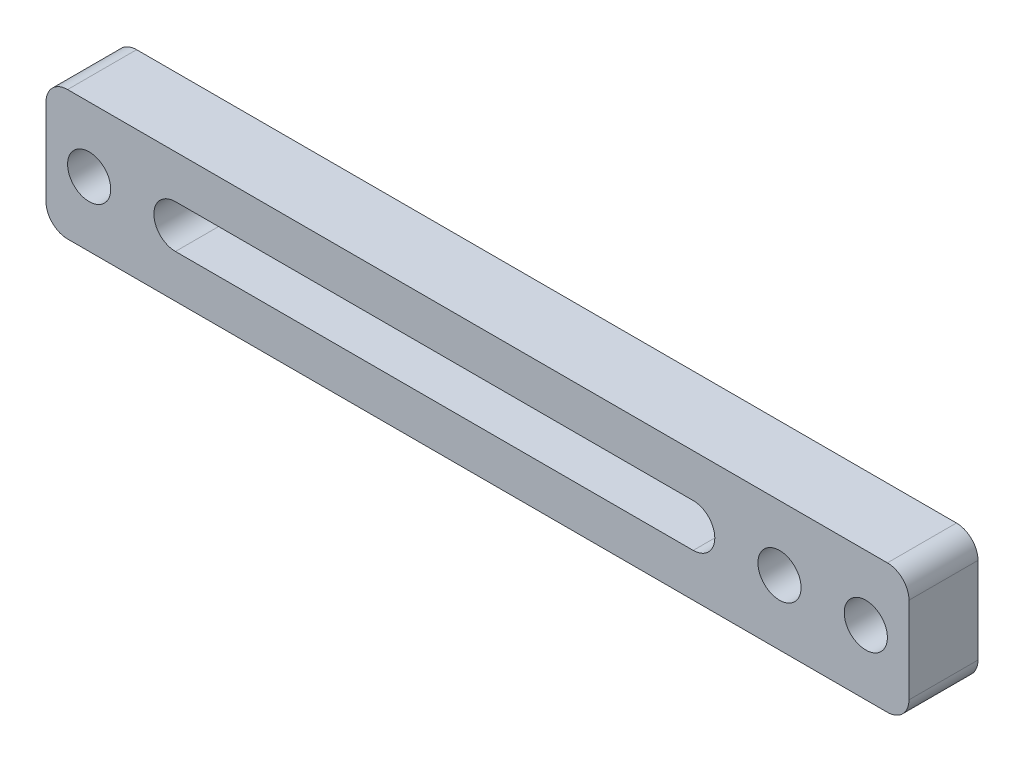
ISO-10303-21;
HEADER;
FILE_DESCRIPTION(('STEP AP214'),'2;1');
FILE_NAME('part.step','',(''),(''),'','','');
FILE_SCHEMA(('AUTOMOTIVE_DESIGN { 1 0 10303 214 1 1 1 1 }'));
ENDSEC;
DATA;
#1=APPLICATION_CONTEXT('core data for automotive mechanical design processes');
#2=APPLICATION_PROTOCOL_DEFINITION('international standard','automotive_design',2000,#1);
#3=PRODUCT_CONTEXT('',#1,'mechanical');
#4=PRODUCT('Part','Part','',(#3));
#5=PRODUCT_RELATED_PRODUCT_CATEGORY('part','',(#4));
#6=PRODUCT_DEFINITION_FORMATION('','',#4);
#7=PRODUCT_DEFINITION_CONTEXT('part definition',#1,'design');
#8=PRODUCT_DEFINITION('design','',#6,#7);
#9=PRODUCT_DEFINITION_SHAPE('','',#8);
#10=(LENGTH_UNIT() NAMED_UNIT(*) SI_UNIT(.MILLI.,.METRE.));
#11=(NAMED_UNIT(*) PLANE_ANGLE_UNIT() SI_UNIT($,.RADIAN.));
#12=(NAMED_UNIT(*) SI_UNIT($,.STERADIAN.) SOLID_ANGLE_UNIT());
#13=UNCERTAINTY_MEASURE_WITH_UNIT(LENGTH_MEASURE(1.E-05),#10,'distance_accuracy_value','');
#14=(GEOMETRIC_REPRESENTATION_CONTEXT(3) GLOBAL_UNCERTAINTY_ASSIGNED_CONTEXT((#13)) GLOBAL_UNIT_ASSIGNED_CONTEXT((#10,
#11,#12)) REPRESENTATION_CONTEXT('',''));
#15=CARTESIAN_POINT('',(0.,0.,0.));
#16=DIRECTION('',(0.,0.,1.));
#17=DIRECTION('',(1.,0.,0.));
#18=AXIS2_PLACEMENT_3D('',#15,#16,#17);
#19=CARTESIAN_POINT('',(0.,0.,8.));
#20=DIRECTION('',(1.,0.,0.));
#21=DIRECTION('',(0.,0.,-1.));
#22=AXIS2_PLACEMENT_3D('',#19,#20,#21);
#23=PLANE('',#22);
#24=DIRECTION('',(0.,-1.,0.));
#25=VECTOR('',#24,1.);
#26=CARTESIAN_POINT('',(0.,0.,0.));
#27=LINE('',#26,#25);
#28=CARTESIAN_POINT('',(0.,12.5,0.));
#29=VERTEX_POINT('',#28);
#30=CARTESIAN_POINT('',(0.,2.5,0.));
#31=VERTEX_POINT('',#30);
#32=EDGE_CURVE('E165',#29,#31,#27,.T.);
#33=ORIENTED_EDGE('',*,*,#32,.T.);
#34=DIRECTION('',(0.,0.,-1.));
#35=VECTOR('',#34,1.);
#36=CARTESIAN_POINT('',(0.,2.5,8.));
#37=LINE('',#36,#35);
#38=CARTESIAN_POINT('',(0.,2.5,8.));
#39=VERTEX_POINT('',#38);
#40=EDGE_CURVE('E11',#31,#39,#37,.F.);
#41=ORIENTED_EDGE('',*,*,#40,.T.);
#42=DIRECTION('',(0.,-1.,0.));
#43=VECTOR('',#42,1.);
#44=CARTESIAN_POINT('',(0.,0.,8.));
#45=LINE('',#44,#43);
#46=CARTESIAN_POINT('',(0.,12.5,8.));
#47=VERTEX_POINT('',#46);
#48=EDGE_CURVE('E169',#47,#39,#45,.T.);
#49=ORIENTED_EDGE('',*,*,#48,.F.);
#50=DIRECTION('',(0.,0.,-1.));
#51=VECTOR('',#50,1.);
#52=CARTESIAN_POINT('',(0.,12.5,8.));
#53=LINE('',#52,#51);
#54=EDGE_CURVE('E39',#47,#29,#53,.T.);
#55=ORIENTED_EDGE('',*,*,#54,.T.);
#56=EDGE_LOOP('',(#33,#41,#49,#55));
#57=FACE_BOUND('',#56,.T.);
#58=ADVANCED_FACE('F31',(#57),#23,.F.);
#59=CARTESIAN_POINT('',(0.,0.,8.));
#60=DIRECTION('',(0.,1.,0.));
#61=DIRECTION('',(0.,0.,1.));
#62=AXIS2_PLACEMENT_3D('',#59,#60,#61);
#63=PLANE('',#62);
#64=DIRECTION('',(1.,0.,0.));
#65=VECTOR('',#64,1.);
#66=CARTESIAN_POINT('',(0.,0.,0.));
#67=LINE('',#66,#65);
#68=CARTESIAN_POINT('',(2.5,0.,0.));
#69=VERTEX_POINT('',#68);
#70=CARTESIAN_POINT('',(97.5,0.,0.));
#71=VERTEX_POINT('',#70);
#72=EDGE_CURVE('E183',#69,#71,#67,.T.);
#73=ORIENTED_EDGE('',*,*,#72,.T.);
#74=DIRECTION('',(0.,0.,-1.));
#75=VECTOR('',#74,1.);
#76=CARTESIAN_POINT('',(97.5,0.,8.));
#77=LINE('',#76,#75);
#78=CARTESIAN_POINT('',(97.5,0.,8.));
#79=VERTEX_POINT('',#78);
#80=EDGE_CURVE('E205',#71,#79,#77,.F.);
#81=ORIENTED_EDGE('',*,*,#80,.T.);
#82=DIRECTION('',(1.,0.,0.));
#83=VECTOR('',#82,1.);
#84=CARTESIAN_POINT('',(0.,0.,8.));
#85=LINE('',#84,#83);
#86=CARTESIAN_POINT('',(2.5,0.,8.));
#87=VERTEX_POINT('',#86);
#88=EDGE_CURVE('E172',#87,#79,#85,.T.);
#89=ORIENTED_EDGE('',*,*,#88,.F.);
#90=DIRECTION('',(0.,0.,-1.));
#91=VECTOR('',#90,1.);
#92=CARTESIAN_POINT('',(2.5,0.,8.));
#93=LINE('',#92,#91);
#94=EDGE_CURVE('E202',#87,#69,#93,.T.);
#95=ORIENTED_EDGE('',*,*,#94,.T.);
#96=EDGE_LOOP('',(#73,#81,#89,#95));
#97=FACE_BOUND('',#96,.T.);
#98=ADVANCED_FACE('F234',(#97),#63,.F.);
#99=CARTESIAN_POINT('',(100.,0.,8.));
#100=DIRECTION('',(-1.,0.,0.));
#101=DIRECTION('',(0.,0.,1.));
#102=AXIS2_PLACEMENT_3D('',#99,#100,#101);
#103=PLANE('',#102);
#104=DIRECTION('',(0.,1.,0.));
#105=VECTOR('',#104,1.);
#106=CARTESIAN_POINT('',(100.,0.,8.));
#107=LINE('',#106,#105);
#108=CARTESIAN_POINT('',(100.,2.5,8.));
#109=VERTEX_POINT('',#108);
#110=CARTESIAN_POINT('',(100.,12.5,8.));
#111=VERTEX_POINT('',#110);
#112=EDGE_CURVE('E176',#109,#111,#107,.T.);
#113=ORIENTED_EDGE('',*,*,#112,.F.);
#114=DIRECTION('',(0.,0.,-1.));
#115=VECTOR('',#114,1.);
#116=CARTESIAN_POINT('',(100.,2.5,8.));
#117=LINE('',#116,#115);
#118=CARTESIAN_POINT('',(100.,2.5,0.));
#119=VERTEX_POINT('',#118);
#120=EDGE_CURVE('E191',#109,#119,#117,.T.);
#121=ORIENTED_EDGE('',*,*,#120,.T.);
#122=DIRECTION('',(0.,1.,0.));
#123=VECTOR('',#122,1.);
#124=CARTESIAN_POINT('',(100.,0.,0.));
#125=LINE('',#124,#123);
#126=CARTESIAN_POINT('',(100.,12.5,0.));
#127=VERTEX_POINT('',#126);
#128=EDGE_CURVE('E186',#119,#127,#125,.T.);
#129=ORIENTED_EDGE('',*,*,#128,.T.);
#130=DIRECTION('',(0.,0.,-1.));
#131=VECTOR('',#130,1.);
#132=CARTESIAN_POINT('',(100.,12.5,8.));
#133=LINE('',#132,#131);
#134=EDGE_CURVE('E180',#127,#111,#133,.F.);
#135=ORIENTED_EDGE('',*,*,#134,.T.);
#136=EDGE_LOOP('',(#113,#121,#129,#135));
#137=FACE_BOUND('',#136,.T.);
#138=ADVANCED_FACE('F243',(#137),#103,.F.);
#139=CARTESIAN_POINT('',(0.,15.,8.));
#140=DIRECTION('',(0.,-1.,0.));
#141=DIRECTION('',(0.,0.,-1.));
#142=AXIS2_PLACEMENT_3D('',#139,#140,#141);
#143=PLANE('',#142);
#144=DIRECTION('',(-1.,0.,0.));
#145=VECTOR('',#144,1.);
#146=CARTESIAN_POINT('',(0.,15.,8.));
#147=LINE('',#146,#145);
#148=CARTESIAN_POINT('',(97.5,15.,8.));
#149=VERTEX_POINT('',#148);
#150=CARTESIAN_POINT('',(2.5,15.,8.));
#151=VERTEX_POINT('',#150);
#152=EDGE_CURVE('E178',#149,#151,#147,.T.);
#153=ORIENTED_EDGE('',*,*,#152,.F.);
#154=DIRECTION('',(0.,0.,-1.));
#155=VECTOR('',#154,1.);
#156=CARTESIAN_POINT('',(97.5,15.,8.));
#157=LINE('',#156,#155);
#158=CARTESIAN_POINT('',(97.5,15.,0.));
#159=VERTEX_POINT('',#158);
#160=EDGE_CURVE('E215',#149,#159,#157,.T.);
#161=ORIENTED_EDGE('',*,*,#160,.T.);
#162=DIRECTION('',(-1.,0.,0.));
#163=VECTOR('',#162,1.);
#164=CARTESIAN_POINT('',(0.,15.,0.));
#165=LINE('',#164,#163);
#166=CARTESIAN_POINT('',(2.5,15.,0.));
#167=VERTEX_POINT('',#166);
#168=EDGE_CURVE('E173',#159,#167,#165,.T.);
#169=ORIENTED_EDGE('',*,*,#168,.T.);
#170=DIRECTION('',(0.,0.,-1.));
#171=VECTOR('',#170,1.);
#172=CARTESIAN_POINT('',(2.5,15.,8.));
#173=LINE('',#172,#171);
#174=EDGE_CURVE('E46',#167,#151,#173,.F.);
#175=ORIENTED_EDGE('',*,*,#174,.T.);
#176=EDGE_LOOP('',(#153,#161,#169,#175));
#177=FACE_BOUND('',#176,.T.);
#178=ADVANCED_FACE('F248',(#177),#143,.F.);
#179=CARTESIAN_POINT('',(0.,15.,8.));
#180=DIRECTION('',(0.,0.,-1.));
#181=DIRECTION('',(-1.,0.,0.));
#182=AXIS2_PLACEMENT_3D('',#179,#180,#181);
#183=PLANE('',#182);
#184=CARTESIAN_POINT('',(85.,7.5,8.));
#185=DIRECTION('',(0.,0.,1.));
#186=DIRECTION('',(1.,0.,0.));
#187=AXIS2_PLACEMENT_3D('',#184,#185,#186);
#188=CIRCLE('',#187,2.50000000000001);
#189=CARTESIAN_POINT('',(87.5,7.5,8.));
#190=VERTEX_POINT('',#189);
#191=EDGE_CURVE('E398',#190,#190,#188,.T.);
#192=ORIENTED_EDGE('',*,*,#191,.F.);
#193=EDGE_LOOP('',(#192));
#194=FACE_BOUND('',#193,.T.);
#195=CARTESIAN_POINT('',(95.,7.5,8.));
#196=DIRECTION('',(0.,0.,1.));
#197=DIRECTION('',(1.,0.,0.));
#198=AXIS2_PLACEMENT_3D('',#195,#196,#197);
#199=CIRCLE('',#198,2.5);
#200=CARTESIAN_POINT('',(97.5,7.5,8.));
#201=VERTEX_POINT('',#200);
#202=EDGE_CURVE('E402',#201,#201,#199,.T.);
#203=ORIENTED_EDGE('',*,*,#202,.F.);
#204=EDGE_LOOP('',(#203));
#205=FACE_BOUND('',#204,.T.);
#206=CARTESIAN_POINT('',(5.,7.5,8.));
#207=DIRECTION('',(0.,0.,1.));
#208=DIRECTION('',(1.,0.,0.));
#209=AXIS2_PLACEMENT_3D('',#206,#207,#208);
#210=CIRCLE('',#209,2.5);
#211=CARTESIAN_POINT('',(7.5,7.5,8.));
#212=VERTEX_POINT('',#211);
#213=EDGE_CURVE('E152',#212,#212,#210,.T.);
#214=ORIENTED_EDGE('',*,*,#213,.F.);
#215=EDGE_LOOP('',(#214));
#216=FACE_BOUND('',#215,.T.);
#217=DIRECTION('',(1.,0.,0.));
#218=VECTOR('',#217,1.);
#219=CARTESIAN_POINT('',(15.,5.,8.));
#220=LINE('',#219,#218);
#221=CARTESIAN_POINT('',(15.,5.,8.));
#222=VERTEX_POINT('',#221);
#223=CARTESIAN_POINT('',(75.,5.,8.));
#224=VERTEX_POINT('',#223);
#225=EDGE_CURVE('E158',#222,#224,#220,.T.);
#226=ORIENTED_EDGE('',*,*,#225,.F.);
#227=CARTESIAN_POINT('',(15.,7.5,8.));
#228=DIRECTION('',(0.,0.,1.));
#229=DIRECTION('',(1.,0.,0.));
#230=AXIS2_PLACEMENT_3D('',#227,#228,#229);
#231=CIRCLE('',#230,2.5);
#232=CARTESIAN_POINT('',(15.,10.,8.));
#233=VERTEX_POINT('',#232);
#234=EDGE_CURVE('E128',#233,#222,#231,.T.);
#235=ORIENTED_EDGE('',*,*,#234,.F.);
#236=DIRECTION('',(-1.,0.,0.));
#237=VECTOR('',#236,1.);
#238=CARTESIAN_POINT('',(15.,10.,8.));
#239=LINE('',#238,#237);
#240=CARTESIAN_POINT('',(75.,10.,8.));
#241=VERTEX_POINT('',#240);
#242=EDGE_CURVE('E146',#241,#233,#239,.T.);
#243=ORIENTED_EDGE('',*,*,#242,.F.);
#244=CARTESIAN_POINT('',(75.,7.5,8.));
#245=DIRECTION('',(0.,0.,1.));
#246=DIRECTION('',(-1.,0.,0.));
#247=AXIS2_PLACEMENT_3D('',#244,#245,#246);
#248=CIRCLE('',#247,2.5);
#249=EDGE_CURVE('E149',#224,#241,#248,.T.);
#250=ORIENTED_EDGE('',*,*,#249,.F.);
#251=EDGE_LOOP('',(#226,#235,#243,#250));
#252=FACE_BOUND('',#251,.T.);
#253=ORIENTED_EDGE('',*,*,#88,.T.);
#254=CARTESIAN_POINT('',(97.5,2.5,8.));
#255=DIRECTION('',(0.,0.,-1.));
#256=DIRECTION('',(-1.,0.,0.));
#257=AXIS2_PLACEMENT_3D('',#254,#255,#256);
#258=CIRCLE('',#257,2.5);
#259=EDGE_CURVE('E212',#79,#109,#258,.F.);
#260=ORIENTED_EDGE('',*,*,#259,.T.);
#261=ORIENTED_EDGE('',*,*,#112,.T.);
#262=CARTESIAN_POINT('',(97.5,12.5,8.));
#263=DIRECTION('',(0.,0.,-1.));
#264=DIRECTION('',(-1.,0.,0.));
#265=AXIS2_PLACEMENT_3D('',#262,#263,#264);
#266=CIRCLE('',#265,2.5);
#267=EDGE_CURVE('E53',#111,#149,#266,.F.);
#268=ORIENTED_EDGE('',*,*,#267,.T.);
#269=ORIENTED_EDGE('',*,*,#152,.T.);
#270=CARTESIAN_POINT('',(2.5,12.5,8.));
#271=DIRECTION('',(0.,0.,-1.));
#272=DIRECTION('',(-1.,0.,0.));
#273=AXIS2_PLACEMENT_3D('',#270,#271,#272);
#274=CIRCLE('',#273,2.5);
#275=EDGE_CURVE('E207',#151,#47,#274,.F.);
#276=ORIENTED_EDGE('',*,*,#275,.T.);
#277=ORIENTED_EDGE('',*,*,#48,.T.);
#278=CARTESIAN_POINT('',(2.5,2.5,8.));
#279=DIRECTION('',(0.,0.,-1.));
#280=DIRECTION('',(-1.,0.,0.));
#281=AXIS2_PLACEMENT_3D('',#278,#279,#280);
#282=CIRCLE('',#281,2.5);
#283=EDGE_CURVE('E209',#39,#87,#282,.F.);
#284=ORIENTED_EDGE('',*,*,#283,.T.);
#285=EDGE_LOOP('',(#253,#260,#261,#268,#269,#276,#277,#284));
#286=FACE_BOUND('',#285,.T.);
#287=ADVANCED_FACE('F237',(#194,#205,#216,#252,#286),#183,.F.);
#288=CARTESIAN_POINT('',(0.,15.,0.));
#289=DIRECTION('',(0.,0.,-1.));
#290=DIRECTION('',(-1.,0.,0.));
#291=AXIS2_PLACEMENT_3D('',#288,#289,#290);
#292=PLANE('',#291);
#293=CARTESIAN_POINT('',(85.,7.5,0.));
#294=DIRECTION('',(0.,0.,1.));
#295=DIRECTION('',(1.,0.,0.));
#296=AXIS2_PLACEMENT_3D('',#293,#294,#295);
#297=CIRCLE('',#296,2.50000000000001);
#298=CARTESIAN_POINT('',(87.5,7.5,0.));
#299=VERTEX_POINT('',#298);
#300=EDGE_CURVE('E415',#299,#299,#297,.T.);
#301=ORIENTED_EDGE('',*,*,#300,.T.);
#302=EDGE_LOOP('',(#301));
#303=FACE_BOUND('',#302,.T.);
#304=CARTESIAN_POINT('',(95.,7.5,0.));
#305=DIRECTION('',(0.,0.,1.));
#306=DIRECTION('',(1.,0.,0.));
#307=AXIS2_PLACEMENT_3D('',#304,#305,#306);
#308=CIRCLE('',#307,2.5);
#309=CARTESIAN_POINT('',(97.5,7.5,0.));
#310=VERTEX_POINT('',#309);
#311=EDGE_CURVE('E409',#310,#310,#308,.T.);
#312=ORIENTED_EDGE('',*,*,#311,.T.);
#313=EDGE_LOOP('',(#312));
#314=FACE_BOUND('',#313,.T.);
#315=CARTESIAN_POINT('',(5.,7.5,0.));
#316=DIRECTION('',(0.,0.,1.));
#317=DIRECTION('',(1.,0.,0.));
#318=AXIS2_PLACEMENT_3D('',#315,#316,#317);
#319=CIRCLE('',#318,2.5);
#320=CARTESIAN_POINT('',(7.5,7.5,0.));
#321=VERTEX_POINT('',#320);
#322=EDGE_CURVE('E159',#321,#321,#319,.T.);
#323=ORIENTED_EDGE('',*,*,#322,.T.);
#324=EDGE_LOOP('',(#323));
#325=FACE_BOUND('',#324,.T.);
#326=CARTESIAN_POINT('',(15.,7.5,0.));
#327=DIRECTION('',(0.,0.,1.));
#328=DIRECTION('',(1.,0.,0.));
#329=AXIS2_PLACEMENT_3D('',#326,#327,#328);
#330=CIRCLE('',#329,2.5);
#331=CARTESIAN_POINT('',(15.,10.,0.));
#332=VERTEX_POINT('',#331);
#333=CARTESIAN_POINT('',(15.,5.,0.));
#334=VERTEX_POINT('',#333);
#335=EDGE_CURVE('E125',#332,#334,#330,.T.);
#336=ORIENTED_EDGE('',*,*,#335,.T.);
#337=DIRECTION('',(1.,0.,0.));
#338=VECTOR('',#337,1.);
#339=CARTESIAN_POINT('',(15.,5.,0.));
#340=LINE('',#339,#338);
#341=CARTESIAN_POINT('',(75.,5.,0.));
#342=VERTEX_POINT('',#341);
#343=EDGE_CURVE('E137',#334,#342,#340,.T.);
#344=ORIENTED_EDGE('',*,*,#343,.T.);
#345=CARTESIAN_POINT('',(75.,7.5,0.));
#346=DIRECTION('',(0.,0.,1.));
#347=DIRECTION('',(-1.,0.,0.));
#348=AXIS2_PLACEMENT_3D('',#345,#346,#347);
#349=CIRCLE('',#348,2.5);
#350=CARTESIAN_POINT('',(75.,10.,0.));
#351=VERTEX_POINT('',#350);
#352=EDGE_CURVE('E141',#342,#351,#349,.T.);
#353=ORIENTED_EDGE('',*,*,#352,.T.);
#354=DIRECTION('',(-1.,0.,0.));
#355=VECTOR('',#354,1.);
#356=CARTESIAN_POINT('',(15.,10.,0.));
#357=LINE('',#356,#355);
#358=EDGE_CURVE('E133',#351,#332,#357,.T.);
#359=ORIENTED_EDGE('',*,*,#358,.T.);
#360=EDGE_LOOP('',(#336,#344,#353,#359));
#361=FACE_BOUND('',#360,.T.);
#362=ORIENTED_EDGE('',*,*,#128,.F.);
#363=CARTESIAN_POINT('',(97.5,2.5,0.));
#364=DIRECTION('',(0.,0.,-1.));
#365=DIRECTION('',(-1.,0.,0.));
#366=AXIS2_PLACEMENT_3D('',#363,#364,#365);
#367=CIRCLE('',#366,2.5);
#368=EDGE_CURVE('E200',#119,#71,#367,.T.);
#369=ORIENTED_EDGE('',*,*,#368,.T.);
#370=ORIENTED_EDGE('',*,*,#72,.F.);
#371=CARTESIAN_POINT('',(2.5,2.5,0.));
#372=DIRECTION('',(0.,0.,-1.));
#373=DIRECTION('',(-1.,0.,0.));
#374=AXIS2_PLACEMENT_3D('',#371,#372,#373);
#375=CIRCLE('',#374,2.5);
#376=EDGE_CURVE('E196',#69,#31,#375,.T.);
#377=ORIENTED_EDGE('',*,*,#376,.T.);
#378=ORIENTED_EDGE('',*,*,#32,.F.);
#379=CARTESIAN_POINT('',(2.5,12.5,0.));
#380=DIRECTION('',(0.,0.,-1.));
#381=DIRECTION('',(-1.,0.,0.));
#382=AXIS2_PLACEMENT_3D('',#379,#380,#381);
#383=CIRCLE('',#382,2.5);
#384=EDGE_CURVE('E194',#29,#167,#383,.T.);
#385=ORIENTED_EDGE('',*,*,#384,.T.);
#386=ORIENTED_EDGE('',*,*,#168,.F.);
#387=CARTESIAN_POINT('',(97.5,12.5,0.));
#388=DIRECTION('',(0.,0.,-1.));
#389=DIRECTION('',(-1.,0.,0.));
#390=AXIS2_PLACEMENT_3D('',#387,#388,#389);
#391=CIRCLE('',#390,2.5);
#392=EDGE_CURVE('E198',#159,#127,#391,.T.);
#393=ORIENTED_EDGE('',*,*,#392,.T.);
#394=EDGE_LOOP('',(#362,#369,#370,#377,#378,#385,#386,#393));
#395=FACE_BOUND('',#394,.T.);
#396=ADVANCED_FACE('F143',(#303,#314,#325,#361,#395),#292,.T.);
#397=CARTESIAN_POINT('',(15.,7.5,0.));
#398=DIRECTION('',(0.,0.,1.));
#399=DIRECTION('',(1.,0.,0.));
#400=AXIS2_PLACEMENT_3D('',#397,#398,#399);
#401=CYLINDRICAL_SURFACE('',#400,2.5);
#402=ORIENTED_EDGE('',*,*,#234,.T.);
#403=DIRECTION('',(0.,0.,1.));
#404=VECTOR('',#403,1.);
#405=CARTESIAN_POINT('',(15.,5.,0.));
#406=LINE('',#405,#404);
#407=EDGE_CURVE('E121',#334,#222,#406,.T.);
#408=ORIENTED_EDGE('',*,*,#407,.F.);
#409=ORIENTED_EDGE('',*,*,#335,.F.);
#410=DIRECTION('',(0.,0.,1.));
#411=VECTOR('',#410,1.);
#412=CARTESIAN_POINT('',(15.,10.,0.));
#413=LINE('',#412,#411);
#414=EDGE_CURVE('E163',#332,#233,#413,.T.);
#415=ORIENTED_EDGE('',*,*,#414,.T.);
#416=EDGE_LOOP('',(#402,#408,#409,#415));
#417=FACE_BOUND('',#416,.T.);
#418=ADVANCED_FACE('F123',(#417),#401,.F.);
#419=CARTESIAN_POINT('',(15.,10.,0.));
#420=DIRECTION('',(0.,1.,0.));
#421=DIRECTION('',(0.,0.,1.));
#422=AXIS2_PLACEMENT_3D('',#419,#420,#421);
#423=PLANE('',#422);
#424=ORIENTED_EDGE('',*,*,#242,.T.);
#425=ORIENTED_EDGE('',*,*,#414,.F.);
#426=ORIENTED_EDGE('',*,*,#358,.F.);
#427=DIRECTION('',(0.,0.,1.));
#428=VECTOR('',#427,1.);
#429=CARTESIAN_POINT('',(75.,10.,0.));
#430=LINE('',#429,#428);
#431=EDGE_CURVE('E166',#351,#241,#430,.T.);
#432=ORIENTED_EDGE('',*,*,#431,.T.);
#433=EDGE_LOOP('',(#424,#425,#426,#432));
#434=FACE_BOUND('',#433,.T.);
#435=ADVANCED_FACE('F328',(#434),#423,.F.);
#436=CARTESIAN_POINT('',(75.,7.5,0.));
#437=DIRECTION('',(0.,0.,1.));
#438=DIRECTION('',(1.,0.,0.));
#439=AXIS2_PLACEMENT_3D('',#436,#437,#438);
#440=CYLINDRICAL_SURFACE('',#439,2.5);
#441=ORIENTED_EDGE('',*,*,#249,.T.);
#442=ORIENTED_EDGE('',*,*,#431,.F.);
#443=ORIENTED_EDGE('',*,*,#352,.F.);
#444=DIRECTION('',(0.,0.,1.));
#445=VECTOR('',#444,1.);
#446=CARTESIAN_POINT('',(75.,5.,0.));
#447=LINE('',#446,#445);
#448=EDGE_CURVE('E132',#342,#224,#447,.T.);
#449=ORIENTED_EDGE('',*,*,#448,.T.);
#450=EDGE_LOOP('',(#441,#442,#443,#449));
#451=FACE_BOUND('',#450,.T.);
#452=ADVANCED_FACE('F320',(#451),#440,.F.);
#453=CARTESIAN_POINT('',(15.,5.,0.));
#454=DIRECTION('',(0.,-1.,0.));
#455=DIRECTION('',(0.,0.,-1.));
#456=AXIS2_PLACEMENT_3D('',#453,#454,#455);
#457=PLANE('',#456);
#458=ORIENTED_EDGE('',*,*,#225,.T.);
#459=ORIENTED_EDGE('',*,*,#448,.F.);
#460=ORIENTED_EDGE('',*,*,#343,.F.);
#461=ORIENTED_EDGE('',*,*,#407,.T.);
#462=EDGE_LOOP('',(#458,#459,#460,#461));
#463=FACE_BOUND('',#462,.T.);
#464=ADVANCED_FACE('F138',(#463),#457,.F.);
#465=CARTESIAN_POINT('',(5.,7.5,0.));
#466=DIRECTION('',(0.,0.,1.));
#467=DIRECTION('',(1.,0.,0.));
#468=AXIS2_PLACEMENT_3D('',#465,#466,#467);
#469=CYLINDRICAL_SURFACE('',#468,2.5);
#470=ORIENTED_EDGE('',*,*,#322,.F.);
#471=EDGE_LOOP('',(#470));
#472=FACE_BOUND('',#471,.T.);
#473=ORIENTED_EDGE('',*,*,#213,.T.);
#474=EDGE_LOOP('',(#473));
#475=FACE_BOUND('',#474,.T.);
#476=ADVANCED_FACE('F303',(#472,#475),#469,.F.);
#477=CARTESIAN_POINT('',(95.,7.5,0.));
#478=DIRECTION('',(0.,0.,1.));
#479=DIRECTION('',(1.,0.,0.));
#480=AXIS2_PLACEMENT_3D('',#477,#478,#479);
#481=CYLINDRICAL_SURFACE('',#480,2.5);
#482=ORIENTED_EDGE('',*,*,#311,.F.);
#483=EDGE_LOOP('',(#482));
#484=FACE_BOUND('',#483,.T.);
#485=ORIENTED_EDGE('',*,*,#202,.T.);
#486=EDGE_LOOP('',(#485));
#487=FACE_BOUND('',#486,.T.);
#488=ADVANCED_FACE('F294',(#484,#487),#481,.F.);
#489=CARTESIAN_POINT('',(85.,7.5,0.));
#490=DIRECTION('',(0.,0.,1.));
#491=DIRECTION('',(1.,0.,0.));
#492=AXIS2_PLACEMENT_3D('',#489,#490,#491);
#493=CYLINDRICAL_SURFACE('',#492,2.50000000000001);
#494=ORIENTED_EDGE('',*,*,#300,.F.);
#495=EDGE_LOOP('',(#494));
#496=FACE_BOUND('',#495,.T.);
#497=ORIENTED_EDGE('',*,*,#191,.T.);
#498=EDGE_LOOP('',(#497));
#499=FACE_BOUND('',#498,.T.);
#500=ADVANCED_FACE('F263',(#496,#499),#493,.F.);
#501=CARTESIAN_POINT('',(97.5,2.5,8.));
#502=DIRECTION('',(0.,0.,-1.));
#503=DIRECTION('',(-1.,0.,0.));
#504=AXIS2_PLACEMENT_3D('',#501,#502,#503);
#505=CYLINDRICAL_SURFACE('',#504,2.5);
#506=ORIENTED_EDGE('',*,*,#259,.F.);
#507=ORIENTED_EDGE('',*,*,#80,.F.);
#508=ORIENTED_EDGE('',*,*,#368,.F.);
#509=ORIENTED_EDGE('',*,*,#120,.F.);
#510=EDGE_LOOP('',(#506,#507,#508,#509));
#511=FACE_BOUND('',#510,.T.);
#512=ADVANCED_FACE('F241',(#511),#505,.T.);
#513=CARTESIAN_POINT('',(97.5,12.5,8.));
#514=DIRECTION('',(0.,0.,-1.));
#515=DIRECTION('',(-1.,0.,0.));
#516=AXIS2_PLACEMENT_3D('',#513,#514,#515);
#517=CYLINDRICAL_SURFACE('',#516,2.5);
#518=ORIENTED_EDGE('',*,*,#267,.F.);
#519=ORIENTED_EDGE('',*,*,#134,.F.);
#520=ORIENTED_EDGE('',*,*,#392,.F.);
#521=ORIENTED_EDGE('',*,*,#160,.F.);
#522=EDGE_LOOP('',(#518,#519,#520,#521));
#523=FACE_BOUND('',#522,.T.);
#524=ADVANCED_FACE('F247',(#523),#517,.T.);
#525=CARTESIAN_POINT('',(2.5,2.5,8.));
#526=DIRECTION('',(0.,0.,-1.));
#527=DIRECTION('',(-1.,0.,0.));
#528=AXIS2_PLACEMENT_3D('',#525,#526,#527);
#529=CYLINDRICAL_SURFACE('',#528,2.5);
#530=ORIENTED_EDGE('',*,*,#283,.F.);
#531=ORIENTED_EDGE('',*,*,#40,.F.);
#532=ORIENTED_EDGE('',*,*,#376,.F.);
#533=ORIENTED_EDGE('',*,*,#94,.F.);
#534=EDGE_LOOP('',(#530,#531,#532,#533));
#535=FACE_BOUND('',#534,.T.);
#536=ADVANCED_FACE('F231',(#535),#529,.T.);
#537=CARTESIAN_POINT('',(2.5,12.5,8.));
#538=DIRECTION('',(0.,0.,-1.));
#539=DIRECTION('',(-1.,0.,0.));
#540=AXIS2_PLACEMENT_3D('',#537,#538,#539);
#541=CYLINDRICAL_SURFACE('',#540,2.5);
#542=ORIENTED_EDGE('',*,*,#275,.F.);
#543=ORIENTED_EDGE('',*,*,#174,.F.);
#544=ORIENTED_EDGE('',*,*,#384,.F.);
#545=ORIENTED_EDGE('',*,*,#54,.F.);
#546=EDGE_LOOP('',(#542,#543,#544,#545));
#547=FACE_BOUND('',#546,.T.);
#548=ADVANCED_FACE('F33',(#547),#541,.T.);
#549=CLOSED_SHELL('',(#58,#98,#138,#178,#287,#396,#418,#435,#452,#464,#476,#488,#500,#512,#524,
#536,#548));
#550=MANIFOLD_SOLID_BREP('B2',#549);
#551=ADVANCED_BREP_SHAPE_REPRESENTATION('',(#18,#550),#14);
#552=SHAPE_DEFINITION_REPRESENTATION(#9,#551);
ENDSEC;
END-ISO-10303-21;
